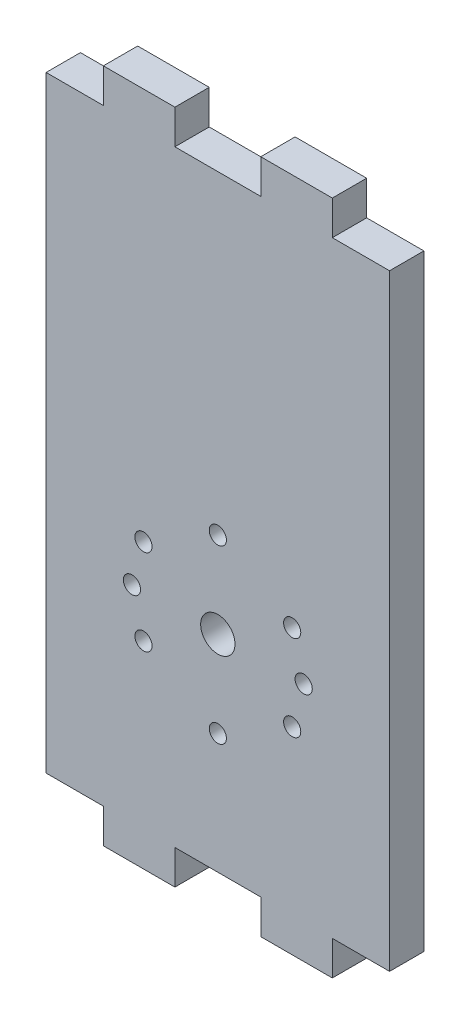
ISO-10303-21;
HEADER;
FILE_DESCRIPTION(('STEP AP214'),'2;1');
FILE_NAME('part.step','',(''),(''),'','','');
FILE_SCHEMA(('AUTOMOTIVE_DESIGN { 1 0 10303 214 1 1 1 1 }'));
ENDSEC;
DATA;
#1=APPLICATION_CONTEXT('core data for automotive mechanical design processes');
#2=APPLICATION_PROTOCOL_DEFINITION('international standard','automotive_design',2000,#1);
#3=PRODUCT_CONTEXT('',#1,'mechanical');
#4=PRODUCT('Part','Part','',(#3));
#5=PRODUCT_RELATED_PRODUCT_CATEGORY('part','',(#4));
#6=PRODUCT_DEFINITION_FORMATION('','',#4);
#7=PRODUCT_DEFINITION_CONTEXT('part definition',#1,'design');
#8=PRODUCT_DEFINITION('design','',#6,#7);
#9=PRODUCT_DEFINITION_SHAPE('','',#8);
#10=(LENGTH_UNIT() NAMED_UNIT(*) SI_UNIT(.MILLI.,.METRE.));
#11=(NAMED_UNIT(*) PLANE_ANGLE_UNIT() SI_UNIT($,.RADIAN.));
#12=(NAMED_UNIT(*) SI_UNIT($,.STERADIAN.) SOLID_ANGLE_UNIT());
#13=UNCERTAINTY_MEASURE_WITH_UNIT(LENGTH_MEASURE(1.E-05),#10,'distance_accuracy_value','');
#14=(GEOMETRIC_REPRESENTATION_CONTEXT(3) GLOBAL_UNCERTAINTY_ASSIGNED_CONTEXT((#13)) GLOBAL_UNIT_ASSIGNED_CONTEXT((#10,
#11,#12)) REPRESENTATION_CONTEXT('',''));
#15=CARTESIAN_POINT('',(0.,0.,0.));
#16=DIRECTION('',(0.,0.,1.));
#17=DIRECTION('',(1.,0.,0.));
#18=AXIS2_PLACEMENT_3D('',#15,#16,#17);
#19=CARTESIAN_POINT('',(0.,0.,3.));
#20=DIRECTION('',(0.,0.,1.));
#21=DIRECTION('',(1.,0.,0.));
#22=AXIS2_PLACEMENT_3D('',#19,#20,#21);
#23=PLANE('',#22);
#24=CARTESIAN_POINT('',(-7.5,-8.5,3.));
#25=DIRECTION('',(0.,0.,1.));
#26=DIRECTION('',(1.,0.,0.));
#27=AXIS2_PLACEMENT_3D('',#24,#25,#26);
#28=CIRCLE('',#27,0.750000000000066);
#29=CARTESIAN_POINT('',(-6.74999999999993,-8.5,3.));
#30=VERTEX_POINT('',#29);
#31=EDGE_CURVE('E415',#30,#30,#28,.T.);
#32=ORIENTED_EDGE('',*,*,#31,.F.);
#33=EDGE_LOOP('',(#32));
#34=FACE_BOUND('',#33,.T.);
#35=CARTESIAN_POINT('',(-6.49519052838329,-12.25,3.));
#36=DIRECTION('',(0.,0.,1.));
#37=DIRECTION('',(1.,0.,0.));
#38=AXIS2_PLACEMENT_3D('',#35,#36,#37);
#39=CIRCLE('',#38,0.75000000000007);
#40=CARTESIAN_POINT('',(-5.74519052838322,-12.25,3.));
#41=VERTEX_POINT('',#40);
#42=EDGE_CURVE('E427',#41,#41,#39,.T.);
#43=ORIENTED_EDGE('',*,*,#42,.F.);
#44=EDGE_LOOP('',(#43));
#45=FACE_BOUND('',#44,.T.);
#46=CARTESIAN_POINT('',(6.49519052838327,-12.25,3.));
#47=DIRECTION('',(0.,0.,1.));
#48=DIRECTION('',(1.,0.,0.));
#49=AXIS2_PLACEMENT_3D('',#46,#47,#48);
#50=CIRCLE('',#49,0.750000000000045);
#51=CARTESIAN_POINT('',(7.24519052838331,-12.25,3.));
#52=VERTEX_POINT('',#51);
#53=EDGE_CURVE('E439',#52,#52,#50,.T.);
#54=ORIENTED_EDGE('',*,*,#53,.F.);
#55=EDGE_LOOP('',(#54));
#56=FACE_BOUND('',#55,.T.);
#57=CARTESIAN_POINT('',(0.,-8.5,3.));
#58=DIRECTION('',(0.,0.,1.));
#59=DIRECTION('',(1.,0.,0.));
#60=AXIS2_PLACEMENT_3D('',#57,#58,#59);
#61=CIRCLE('',#60,1.5);
#62=CARTESIAN_POINT('',(1.5,-8.5,3.));
#63=VERTEX_POINT('',#62);
#64=EDGE_CURVE('E451',#63,#63,#61,.T.);
#65=ORIENTED_EDGE('',*,*,#64,.F.);
#66=EDGE_LOOP('',(#65));
#67=FACE_BOUND('',#66,.T.);
#68=DIRECTION('',(0.,-1.,0.));
#69=VECTOR('',#68,1.);
#70=CARTESIAN_POINT('',(-15.,26.5,3.));
#71=LINE('',#70,#69);
#72=CARTESIAN_POINT('',(-15.,26.5,3.));
#73=VERTEX_POINT('',#72);
#74=CARTESIAN_POINT('',(-15.,-26.5,3.));
#75=VERTEX_POINT('',#74);
#76=EDGE_CURVE('E241',#73,#75,#71,.T.);
#77=ORIENTED_EDGE('',*,*,#76,.T.);
#78=DIRECTION('',(1.,0.,0.));
#79=VECTOR('',#78,1.);
#80=CARTESIAN_POINT('',(-15.,-26.5,3.));
#81=LINE('',#80,#79);
#82=CARTESIAN_POINT('',(-10.,-26.5,3.));
#83=VERTEX_POINT('',#82);
#84=EDGE_CURVE('E129',#75,#83,#81,.T.);
#85=ORIENTED_EDGE('',*,*,#84,.T.);
#86=DIRECTION('',(0.,-1.,0.));
#87=VECTOR('',#86,1.);
#88=CARTESIAN_POINT('',(-10.,-26.5,3.));
#89=LINE('',#88,#87);
#90=CARTESIAN_POINT('',(-10.,-29.5,3.));
#91=VERTEX_POINT('',#90);
#92=EDGE_CURVE('E292',#83,#91,#89,.T.);
#93=ORIENTED_EDGE('',*,*,#92,.T.);
#94=DIRECTION('',(1.,0.,0.));
#95=VECTOR('',#94,1.);
#96=CARTESIAN_POINT('',(-10.,-29.5,3.));
#97=LINE('',#96,#95);
#98=CARTESIAN_POINT('',(-3.75,-29.5,3.));
#99=VERTEX_POINT('',#98);
#100=EDGE_CURVE('E311',#91,#99,#97,.T.);
#101=ORIENTED_EDGE('',*,*,#100,.T.);
#102=DIRECTION('',(0.,1.,0.));
#103=VECTOR('',#102,1.);
#104=CARTESIAN_POINT('',(-3.75,-29.5,3.));
#105=LINE('',#104,#103);
#106=CARTESIAN_POINT('',(-3.74999999999999,-26.5,3.));
#107=VERTEX_POINT('',#106);
#108=EDGE_CURVE('E308',#99,#107,#105,.T.);
#109=ORIENTED_EDGE('',*,*,#108,.T.);
#110=DIRECTION('',(1.,0.,0.));
#111=VECTOR('',#110,1.);
#112=CARTESIAN_POINT('',(-3.74999999999999,-26.5,3.));
#113=LINE('',#112,#111);
#114=CARTESIAN_POINT('',(3.75,-26.5,3.));
#115=VERTEX_POINT('',#114);
#116=EDGE_CURVE('E310',#107,#115,#113,.T.);
#117=ORIENTED_EDGE('',*,*,#116,.T.);
#118=DIRECTION('',(0.,-1.,0.));
#119=VECTOR('',#118,1.);
#120=CARTESIAN_POINT('',(3.75,-26.5,3.));
#121=LINE('',#120,#119);
#122=CARTESIAN_POINT('',(3.75000000000001,-29.5,3.));
#123=VERTEX_POINT('',#122);
#124=EDGE_CURVE('E313',#115,#123,#121,.T.);
#125=ORIENTED_EDGE('',*,*,#124,.T.);
#126=DIRECTION('',(1.,0.,0.));
#127=VECTOR('',#126,1.);
#128=CARTESIAN_POINT('',(3.75000000000001,-29.5,3.));
#129=LINE('',#128,#127);
#130=CARTESIAN_POINT('',(10.,-29.5,3.));
#131=VERTEX_POINT('',#130);
#132=EDGE_CURVE('E319',#123,#131,#129,.T.);
#133=ORIENTED_EDGE('',*,*,#132,.T.);
#134=DIRECTION('',(0.,1.,0.));
#135=VECTOR('',#134,1.);
#136=CARTESIAN_POINT('',(10.,-29.5,3.));
#137=LINE('',#136,#135);
#138=CARTESIAN_POINT('',(10.,-26.5,3.));
#139=VERTEX_POINT('',#138);
#140=EDGE_CURVE('E321',#131,#139,#137,.T.);
#141=ORIENTED_EDGE('',*,*,#140,.T.);
#142=DIRECTION('',(1.,0.,0.));
#143=VECTOR('',#142,1.);
#144=CARTESIAN_POINT('',(10.,-26.5,3.));
#145=LINE('',#144,#143);
#146=CARTESIAN_POINT('',(15.,-26.5,3.));
#147=VERTEX_POINT('',#146);
#148=EDGE_CURVE('E323',#139,#147,#145,.T.);
#149=ORIENTED_EDGE('',*,*,#148,.T.);
#150=DIRECTION('',(0.,1.,0.));
#151=VECTOR('',#150,1.);
#152=CARTESIAN_POINT('',(15.,26.5,3.));
#153=LINE('',#152,#151);
#154=CARTESIAN_POINT('',(15.,26.5,3.));
#155=VERTEX_POINT('',#154);
#156=EDGE_CURVE('E325',#147,#155,#153,.T.);
#157=ORIENTED_EDGE('',*,*,#156,.T.);
#158=DIRECTION('',(-1.,0.,0.));
#159=VECTOR('',#158,1.);
#160=CARTESIAN_POINT('',(10.,26.5,3.));
#161=LINE('',#160,#159);
#162=CARTESIAN_POINT('',(10.,26.5,3.));
#163=VERTEX_POINT('',#162);
#164=EDGE_CURVE('E327',#155,#163,#161,.T.);
#165=ORIENTED_EDGE('',*,*,#164,.T.);
#166=DIRECTION('',(0.,1.,0.));
#167=VECTOR('',#166,1.);
#168=CARTESIAN_POINT('',(10.,29.5,3.));
#169=LINE('',#168,#167);
#170=CARTESIAN_POINT('',(10.,29.5,3.));
#171=VERTEX_POINT('',#170);
#172=EDGE_CURVE('E329',#163,#171,#169,.T.);
#173=ORIENTED_EDGE('',*,*,#172,.T.);
#174=DIRECTION('',(-1.,0.,0.));
#175=VECTOR('',#174,1.);
#176=CARTESIAN_POINT('',(3.75,29.5,3.));
#177=LINE('',#176,#175);
#178=CARTESIAN_POINT('',(3.75,29.5,3.));
#179=VERTEX_POINT('',#178);
#180=EDGE_CURVE('E331',#171,#179,#177,.T.);
#181=ORIENTED_EDGE('',*,*,#180,.T.);
#182=DIRECTION('',(0.,-1.,0.));
#183=VECTOR('',#182,1.);
#184=CARTESIAN_POINT('',(3.75,26.5,3.));
#185=LINE('',#184,#183);
#186=CARTESIAN_POINT('',(3.75,26.5,3.));
#187=VERTEX_POINT('',#186);
#188=EDGE_CURVE('E333',#179,#187,#185,.T.);
#189=ORIENTED_EDGE('',*,*,#188,.T.);
#190=DIRECTION('',(-1.,0.,0.));
#191=VECTOR('',#190,1.);
#192=CARTESIAN_POINT('',(-3.75,26.5,3.));
#193=LINE('',#192,#191);
#194=CARTESIAN_POINT('',(-3.75,26.5,3.));
#195=VERTEX_POINT('',#194);
#196=EDGE_CURVE('E335',#187,#195,#193,.T.);
#197=ORIENTED_EDGE('',*,*,#196,.T.);
#198=DIRECTION('',(0.,1.,0.));
#199=VECTOR('',#198,1.);
#200=CARTESIAN_POINT('',(-3.75,29.5,3.));
#201=LINE('',#200,#199);
#202=CARTESIAN_POINT('',(-3.75,29.5,3.));
#203=VERTEX_POINT('',#202);
#204=EDGE_CURVE('E184',#195,#203,#201,.T.);
#205=ORIENTED_EDGE('',*,*,#204,.T.);
#206=DIRECTION('',(-1.,0.,0.));
#207=VECTOR('',#206,1.);
#208=CARTESIAN_POINT('',(-10.,29.5,3.));
#209=LINE('',#208,#207);
#210=CARTESIAN_POINT('',(-10.,29.5,3.));
#211=VERTEX_POINT('',#210);
#212=EDGE_CURVE('E178',#203,#211,#209,.T.);
#213=ORIENTED_EDGE('',*,*,#212,.T.);
#214=DIRECTION('',(0.,-1.,0.));
#215=VECTOR('',#214,1.);
#216=CARTESIAN_POINT('',(-10.,26.5,3.));
#217=LINE('',#216,#215);
#218=CARTESIAN_POINT('',(-10.,26.5,3.));
#219=VERTEX_POINT('',#218);
#220=EDGE_CURVE('E182',#211,#219,#217,.T.);
#221=ORIENTED_EDGE('',*,*,#220,.T.);
#222=DIRECTION('',(-1.,0.,0.));
#223=VECTOR('',#222,1.);
#224=CARTESIAN_POINT('',(-15.,26.5,3.));
#225=LINE('',#224,#223);
#226=EDGE_CURVE('E50',#219,#73,#225,.T.);
#227=ORIENTED_EDGE('',*,*,#226,.T.);
#228=EDGE_LOOP('',(#77,#85,#93,#101,#109,#117,#125,#133,#141,#149,#157,#165,#173,#181,#189,#197,
#205,#213,#221,#227));
#229=FACE_BOUND('',#228,.T.);
#230=CARTESIAN_POINT('',(0.,-1.,3.));
#231=DIRECTION('',(0.,0.,1.));
#232=DIRECTION('',(1.,0.,0.));
#233=AXIS2_PLACEMENT_3D('',#230,#231,#232);
#234=CIRCLE('',#233,0.750000000000065);
#235=CARTESIAN_POINT('',(0.750000000000065,-1.,3.));
#236=VERTEX_POINT('',#235);
#237=EDGE_CURVE('E206',#236,#236,#234,.T.);
#238=ORIENTED_EDGE('',*,*,#237,.F.);
#239=EDGE_LOOP('',(#238));
#240=FACE_BOUND('',#239,.T.);
#241=CARTESIAN_POINT('',(6.49519052838329,-4.75000000000001,3.));
#242=DIRECTION('',(0.,0.,1.));
#243=DIRECTION('',(1.,0.,0.));
#244=AXIS2_PLACEMENT_3D('',#241,#242,#243);
#245=CIRCLE('',#244,0.750000000000064);
#246=CARTESIAN_POINT('',(7.24519052838335,-4.75000000000001,3.));
#247=VERTEX_POINT('',#246);
#248=EDGE_CURVE('E445',#247,#247,#245,.T.);
#249=ORIENTED_EDGE('',*,*,#248,.F.);
#250=EDGE_LOOP('',(#249));
#251=FACE_BOUND('',#250,.T.);
#252=CARTESIAN_POINT('',(0.,-16.,3.));
#253=DIRECTION('',(0.,0.,1.));
#254=DIRECTION('',(1.,0.,0.));
#255=AXIS2_PLACEMENT_3D('',#252,#253,#254);
#256=CIRCLE('',#255,0.750000000000065);
#257=CARTESIAN_POINT('',(0.750000000000086,-16.,3.));
#258=VERTEX_POINT('',#257);
#259=EDGE_CURVE('E433',#258,#258,#256,.T.);
#260=ORIENTED_EDGE('',*,*,#259,.F.);
#261=EDGE_LOOP('',(#260));
#262=FACE_BOUND('',#261,.T.);
#263=CARTESIAN_POINT('',(-6.49519052838331,-4.75000000000004,3.));
#264=DIRECTION('',(0.,0.,1.));
#265=DIRECTION('',(1.,0.,0.));
#266=AXIS2_PLACEMENT_3D('',#263,#264,#265);
#267=CIRCLE('',#266,0.750000000000043);
#268=CARTESIAN_POINT('',(-5.74519052838327,-4.75000000000004,3.));
#269=VERTEX_POINT('',#268);
#270=EDGE_CURVE('E421',#269,#269,#267,.T.);
#271=ORIENTED_EDGE('',*,*,#270,.F.);
#272=EDGE_LOOP('',(#271));
#273=FACE_BOUND('',#272,.T.);
#274=CARTESIAN_POINT('',(7.5,-8.5,3.));
#275=DIRECTION('',(0.,0.,1.));
#276=DIRECTION('',(1.,0.,0.));
#277=AXIS2_PLACEMENT_3D('',#274,#275,#276);
#278=CIRCLE('',#277,0.750000000000067);
#279=CARTESIAN_POINT('',(8.25000000000006,-8.5,3.));
#280=VERTEX_POINT('',#279);
#281=EDGE_CURVE('E406',#280,#280,#278,.T.);
#282=ORIENTED_EDGE('',*,*,#281,.F.);
#283=EDGE_LOOP('',(#282));
#284=FACE_BOUND('',#283,.T.);
#285=ADVANCED_FACE('F33',(#34,#45,#56,#67,#229,#240,#251,#262,#273,#284),#23,.T.);
#286=CARTESIAN_POINT('',(0.,0.,0.));
#287=DIRECTION('',(0.,0.,1.));
#288=DIRECTION('',(1.,0.,0.));
#289=AXIS2_PLACEMENT_3D('',#286,#287,#288);
#290=PLANE('',#289);
#291=DIRECTION('',(0.,-1.,0.));
#292=VECTOR('',#291,1.);
#293=CARTESIAN_POINT('',(-15.,26.5,0.));
#294=LINE('',#293,#292);
#295=CARTESIAN_POINT('',(-15.,26.5,0.));
#296=VERTEX_POINT('',#295);
#297=CARTESIAN_POINT('',(-15.,-26.5,0.));
#298=VERTEX_POINT('',#297);
#299=EDGE_CURVE('E202',#296,#298,#294,.T.);
#300=ORIENTED_EDGE('',*,*,#299,.F.);
#301=DIRECTION('',(-1.,0.,0.));
#302=VECTOR('',#301,1.);
#303=CARTESIAN_POINT('',(-15.,26.5,0.));
#304=LINE('',#303,#302);
#305=CARTESIAN_POINT('',(-10.,26.5,0.));
#306=VERTEX_POINT('',#305);
#307=EDGE_CURVE('E121',#306,#296,#304,.T.);
#308=ORIENTED_EDGE('',*,*,#307,.F.);
#309=DIRECTION('',(0.,-1.,0.));
#310=VECTOR('',#309,1.);
#311=CARTESIAN_POINT('',(-10.,26.5,0.));
#312=LINE('',#311,#310);
#313=CARTESIAN_POINT('',(-10.,29.5,0.));
#314=VERTEX_POINT('',#313);
#315=EDGE_CURVE('E115',#314,#306,#312,.T.);
#316=ORIENTED_EDGE('',*,*,#315,.F.);
#317=DIRECTION('',(-1.,0.,0.));
#318=VECTOR('',#317,1.);
#319=CARTESIAN_POINT('',(-10.,29.5,0.));
#320=LINE('',#319,#318);
#321=CARTESIAN_POINT('',(-3.75,29.5,0.));
#322=VERTEX_POINT('',#321);
#323=EDGE_CURVE('E192',#322,#314,#320,.T.);
#324=ORIENTED_EDGE('',*,*,#323,.F.);
#325=DIRECTION('',(0.,1.,0.));
#326=VECTOR('',#325,1.);
#327=CARTESIAN_POINT('',(-3.75,29.5,0.));
#328=LINE('',#327,#326);
#329=CARTESIAN_POINT('',(-3.75,26.5,0.));
#330=VERTEX_POINT('',#329);
#331=EDGE_CURVE('E236',#330,#322,#328,.T.);
#332=ORIENTED_EDGE('',*,*,#331,.F.);
#333=DIRECTION('',(-1.,0.,0.));
#334=VECTOR('',#333,1.);
#335=CARTESIAN_POINT('',(-3.75,26.5,0.));
#336=LINE('',#335,#334);
#337=CARTESIAN_POINT('',(3.75,26.5,0.));
#338=VERTEX_POINT('',#337);
#339=EDGE_CURVE('E234',#338,#330,#336,.T.);
#340=ORIENTED_EDGE('',*,*,#339,.F.);
#341=DIRECTION('',(0.,-1.,0.));
#342=VECTOR('',#341,1.);
#343=CARTESIAN_POINT('',(3.75,26.5,0.));
#344=LINE('',#343,#342);
#345=CARTESIAN_POINT('',(3.75,29.5,0.));
#346=VERTEX_POINT('',#345);
#347=EDGE_CURVE('E232',#346,#338,#344,.T.);
#348=ORIENTED_EDGE('',*,*,#347,.F.);
#349=DIRECTION('',(-1.,0.,0.));
#350=VECTOR('',#349,1.);
#351=CARTESIAN_POINT('',(3.75,29.5,0.));
#352=LINE('',#351,#350);
#353=CARTESIAN_POINT('',(10.,29.5,0.));
#354=VERTEX_POINT('',#353);
#355=EDGE_CURVE('E230',#354,#346,#352,.T.);
#356=ORIENTED_EDGE('',*,*,#355,.F.);
#357=DIRECTION('',(0.,1.,0.));
#358=VECTOR('',#357,1.);
#359=CARTESIAN_POINT('',(10.,29.5,0.));
#360=LINE('',#359,#358);
#361=CARTESIAN_POINT('',(10.,26.5,0.));
#362=VERTEX_POINT('',#361);
#363=EDGE_CURVE('E228',#362,#354,#360,.T.);
#364=ORIENTED_EDGE('',*,*,#363,.F.);
#365=DIRECTION('',(-1.,0.,0.));
#366=VECTOR('',#365,1.);
#367=CARTESIAN_POINT('',(10.,26.5,0.));
#368=LINE('',#367,#366);
#369=CARTESIAN_POINT('',(15.,26.5,0.));
#370=VERTEX_POINT('',#369);
#371=EDGE_CURVE('E226',#370,#362,#368,.T.);
#372=ORIENTED_EDGE('',*,*,#371,.F.);
#373=DIRECTION('',(0.,1.,0.));
#374=VECTOR('',#373,1.);
#375=CARTESIAN_POINT('',(15.,26.5,0.));
#376=LINE('',#375,#374);
#377=CARTESIAN_POINT('',(15.,-26.5,0.));
#378=VERTEX_POINT('',#377);
#379=EDGE_CURVE('E224',#378,#370,#376,.T.);
#380=ORIENTED_EDGE('',*,*,#379,.F.);
#381=DIRECTION('',(1.,0.,0.));
#382=VECTOR('',#381,1.);
#383=CARTESIAN_POINT('',(10.,-26.5,0.));
#384=LINE('',#383,#382);
#385=CARTESIAN_POINT('',(10.,-26.5,0.));
#386=VERTEX_POINT('',#385);
#387=EDGE_CURVE('E222',#386,#378,#384,.T.);
#388=ORIENTED_EDGE('',*,*,#387,.F.);
#389=DIRECTION('',(0.,1.,0.));
#390=VECTOR('',#389,1.);
#391=CARTESIAN_POINT('',(10.,-29.5,0.));
#392=LINE('',#391,#390);
#393=CARTESIAN_POINT('',(10.,-29.5,0.));
#394=VERTEX_POINT('',#393);
#395=EDGE_CURVE('E220',#394,#386,#392,.T.);
#396=ORIENTED_EDGE('',*,*,#395,.F.);
#397=DIRECTION('',(1.,0.,0.));
#398=VECTOR('',#397,1.);
#399=CARTESIAN_POINT('',(3.75000000000001,-29.5,0.));
#400=LINE('',#399,#398);
#401=CARTESIAN_POINT('',(3.75000000000001,-29.5,0.));
#402=VERTEX_POINT('',#401);
#403=EDGE_CURVE('E218',#402,#394,#400,.T.);
#404=ORIENTED_EDGE('',*,*,#403,.F.);
#405=DIRECTION('',(0.,-1.,0.));
#406=VECTOR('',#405,1.);
#407=CARTESIAN_POINT('',(3.75,-26.5,0.));
#408=LINE('',#407,#406);
#409=CARTESIAN_POINT('',(3.75,-26.5,0.));
#410=VERTEX_POINT('',#409);
#411=EDGE_CURVE('E216',#410,#402,#408,.T.);
#412=ORIENTED_EDGE('',*,*,#411,.F.);
#413=DIRECTION('',(1.,0.,0.));
#414=VECTOR('',#413,1.);
#415=CARTESIAN_POINT('',(-3.74999999999999,-26.5,0.));
#416=LINE('',#415,#414);
#417=CARTESIAN_POINT('',(-3.74999999999999,-26.5,0.));
#418=VERTEX_POINT('',#417);
#419=EDGE_CURVE('E214',#418,#410,#416,.T.);
#420=ORIENTED_EDGE('',*,*,#419,.F.);
#421=DIRECTION('',(0.,1.,0.));
#422=VECTOR('',#421,1.);
#423=CARTESIAN_POINT('',(-3.75,-29.5,0.));
#424=LINE('',#423,#422);
#425=CARTESIAN_POINT('',(-3.75,-29.5,0.));
#426=VERTEX_POINT('',#425);
#427=EDGE_CURVE('E212',#426,#418,#424,.T.);
#428=ORIENTED_EDGE('',*,*,#427,.F.);
#429=DIRECTION('',(1.,0.,0.));
#430=VECTOR('',#429,1.);
#431=CARTESIAN_POINT('',(-10.,-29.5,0.));
#432=LINE('',#431,#430);
#433=CARTESIAN_POINT('',(-10.,-29.5,0.));
#434=VERTEX_POINT('',#433);
#435=EDGE_CURVE('E210',#434,#426,#432,.T.);
#436=ORIENTED_EDGE('',*,*,#435,.F.);
#437=DIRECTION('',(0.,-1.,0.));
#438=VECTOR('',#437,1.);
#439=CARTESIAN_POINT('',(-10.,-26.5,0.));
#440=LINE('',#439,#438);
#441=CARTESIAN_POINT('',(-10.,-26.5,0.));
#442=VERTEX_POINT('',#441);
#443=EDGE_CURVE('E208',#442,#434,#440,.T.);
#444=ORIENTED_EDGE('',*,*,#443,.F.);
#445=DIRECTION('',(1.,0.,0.));
#446=VECTOR('',#445,1.);
#447=CARTESIAN_POINT('',(-15.,-26.5,0.));
#448=LINE('',#447,#446);
#449=EDGE_CURVE('E205',#298,#442,#448,.T.);
#450=ORIENTED_EDGE('',*,*,#449,.F.);
#451=EDGE_LOOP('',(#300,#308,#316,#324,#332,#340,#348,#356,#364,#372,#380,#388,#396,#404,#412,
#420,#428,#436,#444,#450));
#452=FACE_BOUND('',#451,.T.);
#453=CARTESIAN_POINT('',(0.,-1.,0.));
#454=DIRECTION('',(0.,0.,1.));
#455=DIRECTION('',(1.,0.,0.));
#456=AXIS2_PLACEMENT_3D('',#453,#454,#455);
#457=CIRCLE('',#456,0.750000000000065);
#458=CARTESIAN_POINT('',(0.750000000000065,-1.,0.));
#459=VERTEX_POINT('',#458);
#460=EDGE_CURVE('E454',#459,#459,#457,.T.);
#461=ORIENTED_EDGE('',*,*,#460,.T.);
#462=EDGE_LOOP('',(#461));
#463=FACE_BOUND('',#462,.T.);
#464=CARTESIAN_POINT('',(0.,-8.5,0.));
#465=DIRECTION('',(0.,0.,1.));
#466=DIRECTION('',(1.,0.,0.));
#467=AXIS2_PLACEMENT_3D('',#464,#465,#466);
#468=CIRCLE('',#467,1.5);
#469=CARTESIAN_POINT('',(1.5,-8.5,0.));
#470=VERTEX_POINT('',#469);
#471=EDGE_CURVE('E448',#470,#470,#468,.T.);
#472=ORIENTED_EDGE('',*,*,#471,.T.);
#473=EDGE_LOOP('',(#472));
#474=FACE_BOUND('',#473,.T.);
#475=CARTESIAN_POINT('',(6.49519052838329,-4.75000000000001,0.));
#476=DIRECTION('',(0.,0.,1.));
#477=DIRECTION('',(1.,0.,0.));
#478=AXIS2_PLACEMENT_3D('',#475,#476,#477);
#479=CIRCLE('',#478,0.750000000000064);
#480=CARTESIAN_POINT('',(7.24519052838335,-4.75000000000001,0.));
#481=VERTEX_POINT('',#480);
#482=EDGE_CURVE('E442',#481,#481,#479,.T.);
#483=ORIENTED_EDGE('',*,*,#482,.T.);
#484=EDGE_LOOP('',(#483));
#485=FACE_BOUND('',#484,.T.);
#486=CARTESIAN_POINT('',(6.49519052838327,-12.25,0.));
#487=DIRECTION('',(0.,0.,1.));
#488=DIRECTION('',(1.,0.,0.));
#489=AXIS2_PLACEMENT_3D('',#486,#487,#488);
#490=CIRCLE('',#489,0.750000000000045);
#491=CARTESIAN_POINT('',(7.24519052838331,-12.25,0.));
#492=VERTEX_POINT('',#491);
#493=EDGE_CURVE('E436',#492,#492,#490,.T.);
#494=ORIENTED_EDGE('',*,*,#493,.T.);
#495=EDGE_LOOP('',(#494));
#496=FACE_BOUND('',#495,.T.);
#497=CARTESIAN_POINT('',(0.,-16.,0.));
#498=DIRECTION('',(0.,0.,1.));
#499=DIRECTION('',(1.,0.,0.));
#500=AXIS2_PLACEMENT_3D('',#497,#498,#499);
#501=CIRCLE('',#500,0.750000000000065);
#502=CARTESIAN_POINT('',(0.750000000000086,-16.,0.));
#503=VERTEX_POINT('',#502);
#504=EDGE_CURVE('E430',#503,#503,#501,.T.);
#505=ORIENTED_EDGE('',*,*,#504,.T.);
#506=EDGE_LOOP('',(#505));
#507=FACE_BOUND('',#506,.T.);
#508=CARTESIAN_POINT('',(-6.49519052838329,-12.25,0.));
#509=DIRECTION('',(0.,0.,1.));
#510=DIRECTION('',(1.,0.,0.));
#511=AXIS2_PLACEMENT_3D('',#508,#509,#510);
#512=CIRCLE('',#511,0.75000000000007);
#513=CARTESIAN_POINT('',(-5.74519052838322,-12.25,0.));
#514=VERTEX_POINT('',#513);
#515=EDGE_CURVE('E424',#514,#514,#512,.T.);
#516=ORIENTED_EDGE('',*,*,#515,.T.);
#517=EDGE_LOOP('',(#516));
#518=FACE_BOUND('',#517,.T.);
#519=CARTESIAN_POINT('',(-6.49519052838331,-4.75000000000004,0.));
#520=DIRECTION('',(0.,0.,1.));
#521=DIRECTION('',(1.,0.,0.));
#522=AXIS2_PLACEMENT_3D('',#519,#520,#521);
#523=CIRCLE('',#522,0.750000000000043);
#524=CARTESIAN_POINT('',(-5.74519052838327,-4.75000000000004,0.));
#525=VERTEX_POINT('',#524);
#526=EDGE_CURVE('E418',#525,#525,#523,.T.);
#527=ORIENTED_EDGE('',*,*,#526,.T.);
#528=EDGE_LOOP('',(#527));
#529=FACE_BOUND('',#528,.T.);
#530=CARTESIAN_POINT('',(-7.5,-8.5,0.));
#531=DIRECTION('',(0.,0.,1.));
#532=DIRECTION('',(1.,0.,0.));
#533=AXIS2_PLACEMENT_3D('',#530,#531,#532);
#534=CIRCLE('',#533,0.750000000000066);
#535=CARTESIAN_POINT('',(-6.74999999999993,-8.5,0.));
#536=VERTEX_POINT('',#535);
#537=EDGE_CURVE('E412',#536,#536,#534,.T.);
#538=ORIENTED_EDGE('',*,*,#537,.T.);
#539=EDGE_LOOP('',(#538));
#540=FACE_BOUND('',#539,.T.);
#541=CARTESIAN_POINT('',(7.5,-8.5,0.));
#542=DIRECTION('',(0.,0.,1.));
#543=DIRECTION('',(1.,0.,0.));
#544=AXIS2_PLACEMENT_3D('',#541,#542,#543);
#545=CIRCLE('',#544,0.750000000000067);
#546=CARTESIAN_POINT('',(8.25000000000006,-8.5,0.));
#547=VERTEX_POINT('',#546);
#548=EDGE_CURVE('E409',#547,#547,#545,.T.);
#549=ORIENTED_EDGE('',*,*,#548,.T.);
#550=EDGE_LOOP('',(#549));
#551=FACE_BOUND('',#550,.T.);
#552=ADVANCED_FACE('F296',(#452,#463,#474,#485,#496,#507,#518,#529,#540,#551),#290,.F.);
#553=CARTESIAN_POINT('',(-15.,26.5,3.));
#554=DIRECTION('',(1.,0.,0.));
#555=DIRECTION('',(0.,0.,-1.));
#556=AXIS2_PLACEMENT_3D('',#553,#554,#555);
#557=PLANE('',#556);
#558=ORIENTED_EDGE('',*,*,#299,.T.);
#559=DIRECTION('',(0.,0.,-1.));
#560=VECTOR('',#559,1.);
#561=CARTESIAN_POINT('',(-15.,-26.5,3.));
#562=LINE('',#561,#560);
#563=EDGE_CURVE('E11',#75,#298,#562,.T.);
#564=ORIENTED_EDGE('',*,*,#563,.F.);
#565=ORIENTED_EDGE('',*,*,#76,.F.);
#566=DIRECTION('',(0.,0.,-1.));
#567=VECTOR('',#566,1.);
#568=CARTESIAN_POINT('',(-15.,26.5,3.));
#569=LINE('',#568,#567);
#570=EDGE_CURVE('E198',#73,#296,#569,.T.);
#571=ORIENTED_EDGE('',*,*,#570,.T.);
#572=EDGE_LOOP('',(#558,#564,#565,#571));
#573=FACE_BOUND('',#572,.T.);
#574=ADVANCED_FACE('F35',(#573),#557,.F.);
#575=CARTESIAN_POINT('',(-15.,-26.5,3.));
#576=DIRECTION('',(0.,1.,0.));
#577=DIRECTION('',(0.,0.,1.));
#578=AXIS2_PLACEMENT_3D('',#575,#576,#577);
#579=PLANE('',#578);
#580=ORIENTED_EDGE('',*,*,#449,.T.);
#581=DIRECTION('',(0.,0.,-1.));
#582=VECTOR('',#581,1.);
#583=CARTESIAN_POINT('',(-10.,-26.5,3.));
#584=LINE('',#583,#582);
#585=EDGE_CURVE('E42',#83,#442,#584,.T.);
#586=ORIENTED_EDGE('',*,*,#585,.F.);
#587=ORIENTED_EDGE('',*,*,#84,.F.);
#588=ORIENTED_EDGE('',*,*,#563,.T.);
#589=EDGE_LOOP('',(#580,#586,#587,#588));
#590=FACE_BOUND('',#589,.T.);
#591=ADVANCED_FACE('F689',(#590),#579,.F.);
#592=CARTESIAN_POINT('',(-10.,-26.5,3.));
#593=DIRECTION('',(1.,0.,0.));
#594=DIRECTION('',(0.,0.,-1.));
#595=AXIS2_PLACEMENT_3D('',#592,#593,#594);
#596=PLANE('',#595);
#597=ORIENTED_EDGE('',*,*,#443,.T.);
#598=DIRECTION('',(0.,0.,-1.));
#599=VECTOR('',#598,1.);
#600=CARTESIAN_POINT('',(-10.,-29.5,3.));
#601=LINE('',#600,#599);
#602=EDGE_CURVE('E284',#91,#434,#601,.T.);
#603=ORIENTED_EDGE('',*,*,#602,.F.);
#604=ORIENTED_EDGE('',*,*,#92,.F.);
#605=ORIENTED_EDGE('',*,*,#585,.T.);
#606=EDGE_LOOP('',(#597,#603,#604,#605));
#607=FACE_BOUND('',#606,.T.);
#608=ADVANCED_FACE('F290',(#607),#596,.F.);
#609=CARTESIAN_POINT('',(-10.,-29.5,3.));
#610=DIRECTION('',(0.,1.,0.));
#611=DIRECTION('',(-1.,0.,0.));
#612=AXIS2_PLACEMENT_3D('',#609,#610,#611);
#613=PLANE('',#612);
#614=ORIENTED_EDGE('',*,*,#435,.T.);
#615=DIRECTION('',(0.,0.,-1.));
#616=VECTOR('',#615,1.);
#617=CARTESIAN_POINT('',(-3.75,-29.5,3.));
#618=LINE('',#617,#616);
#619=EDGE_CURVE('E281',#99,#426,#618,.T.);
#620=ORIENTED_EDGE('',*,*,#619,.F.);
#621=ORIENTED_EDGE('',*,*,#100,.F.);
#622=ORIENTED_EDGE('',*,*,#602,.T.);
#623=EDGE_LOOP('',(#614,#620,#621,#622));
#624=FACE_BOUND('',#623,.T.);
#625=ADVANCED_FACE('F302',(#624),#613,.F.);
#626=CARTESIAN_POINT('',(-3.75,-29.5,3.));
#627=DIRECTION('',(-1.,0.,0.));
#628=DIRECTION('',(0.,-1.,0.));
#629=AXIS2_PLACEMENT_3D('',#626,#627,#628);
#630=PLANE('',#629);
#631=ORIENTED_EDGE('',*,*,#427,.T.);
#632=DIRECTION('',(0.,0.,-1.));
#633=VECTOR('',#632,1.);
#634=CARTESIAN_POINT('',(-3.74999999999999,-26.5,3.));
#635=LINE('',#634,#633);
#636=EDGE_CURVE('E278',#107,#418,#635,.T.);
#637=ORIENTED_EDGE('',*,*,#636,.F.);
#638=ORIENTED_EDGE('',*,*,#108,.F.);
#639=ORIENTED_EDGE('',*,*,#619,.T.);
#640=EDGE_LOOP('',(#631,#637,#638,#639));
#641=FACE_BOUND('',#640,.T.);
#642=ADVANCED_FACE('F306',(#641),#630,.F.);
#643=CARTESIAN_POINT('',(-3.74999999999999,-26.5,3.));
#644=DIRECTION('',(0.,1.,0.));
#645=DIRECTION('',(0.,0.,1.));
#646=AXIS2_PLACEMENT_3D('',#643,#644,#645);
#647=PLANE('',#646);
#648=ORIENTED_EDGE('',*,*,#419,.T.);
#649=DIRECTION('',(0.,0.,-1.));
#650=VECTOR('',#649,1.);
#651=CARTESIAN_POINT('',(3.75,-26.5,3.));
#652=LINE('',#651,#650);
#653=EDGE_CURVE('E275',#115,#410,#652,.T.);
#654=ORIENTED_EDGE('',*,*,#653,.F.);
#655=ORIENTED_EDGE('',*,*,#116,.F.);
#656=ORIENTED_EDGE('',*,*,#636,.T.);
#657=EDGE_LOOP('',(#648,#654,#655,#656));
#658=FACE_BOUND('',#657,.T.);
#659=ADVANCED_FACE('F654',(#658),#647,.F.);
#660=CARTESIAN_POINT('',(3.75,-26.5,3.));
#661=DIRECTION('',(1.,0.,0.));
#662=DIRECTION('',(0.,1.,0.));
#663=AXIS2_PLACEMENT_3D('',#660,#661,#662);
#664=PLANE('',#663);
#665=ORIENTED_EDGE('',*,*,#411,.T.);
#666=DIRECTION('',(0.,0.,-1.));
#667=VECTOR('',#666,1.);
#668=CARTESIAN_POINT('',(3.75000000000001,-29.5,3.));
#669=LINE('',#668,#667);
#670=EDGE_CURVE('E272',#123,#402,#669,.T.);
#671=ORIENTED_EDGE('',*,*,#670,.F.);
#672=ORIENTED_EDGE('',*,*,#124,.F.);
#673=ORIENTED_EDGE('',*,*,#653,.T.);
#674=EDGE_LOOP('',(#665,#671,#672,#673));
#675=FACE_BOUND('',#674,.T.);
#676=ADVANCED_FACE('F644',(#675),#664,.F.);
#677=CARTESIAN_POINT('',(3.75000000000001,-29.5,3.));
#678=DIRECTION('',(0.,1.,0.));
#679=DIRECTION('',(-1.,0.,0.));
#680=AXIS2_PLACEMENT_3D('',#677,#678,#679);
#681=PLANE('',#680);
#682=ORIENTED_EDGE('',*,*,#403,.T.);
#683=DIRECTION('',(0.,0.,-1.));
#684=VECTOR('',#683,1.);
#685=CARTESIAN_POINT('',(10.,-29.5,3.));
#686=LINE('',#685,#684);
#687=EDGE_CURVE('E269',#131,#394,#686,.T.);
#688=ORIENTED_EDGE('',*,*,#687,.F.);
#689=ORIENTED_EDGE('',*,*,#132,.F.);
#690=ORIENTED_EDGE('',*,*,#670,.T.);
#691=EDGE_LOOP('',(#682,#688,#689,#690));
#692=FACE_BOUND('',#691,.T.);
#693=ADVANCED_FACE('F634',(#692),#681,.F.);
#694=CARTESIAN_POINT('',(10.,-29.5,3.));
#695=DIRECTION('',(-1.,0.,0.));
#696=DIRECTION('',(0.,0.,1.));
#697=AXIS2_PLACEMENT_3D('',#694,#695,#696);
#698=PLANE('',#697);
#699=ORIENTED_EDGE('',*,*,#395,.T.);
#700=DIRECTION('',(0.,0.,-1.));
#701=VECTOR('',#700,1.);
#702=CARTESIAN_POINT('',(10.,-26.5,3.));
#703=LINE('',#702,#701);
#704=EDGE_CURVE('E266',#139,#386,#703,.T.);
#705=ORIENTED_EDGE('',*,*,#704,.F.);
#706=ORIENTED_EDGE('',*,*,#140,.F.);
#707=ORIENTED_EDGE('',*,*,#687,.T.);
#708=EDGE_LOOP('',(#699,#705,#706,#707));
#709=FACE_BOUND('',#708,.T.);
#710=ADVANCED_FACE('F624',(#709),#698,.F.);
#711=CARTESIAN_POINT('',(10.,-26.5,3.));
#712=DIRECTION('',(0.,1.,0.));
#713=DIRECTION('',(0.,0.,1.));
#714=AXIS2_PLACEMENT_3D('',#711,#712,#713);
#715=PLANE('',#714);
#716=ORIENTED_EDGE('',*,*,#387,.T.);
#717=DIRECTION('',(0.,0.,-1.));
#718=VECTOR('',#717,1.);
#719=CARTESIAN_POINT('',(15.,-26.5,3.));
#720=LINE('',#719,#718);
#721=EDGE_CURVE('E263',#147,#378,#720,.T.);
#722=ORIENTED_EDGE('',*,*,#721,.F.);
#723=ORIENTED_EDGE('',*,*,#148,.F.);
#724=ORIENTED_EDGE('',*,*,#704,.T.);
#725=EDGE_LOOP('',(#716,#722,#723,#724));
#726=FACE_BOUND('',#725,.T.);
#727=ADVANCED_FACE('F614',(#726),#715,.F.);
#728=CARTESIAN_POINT('',(15.,26.5,3.));
#729=DIRECTION('',(-1.,0.,0.));
#730=DIRECTION('',(0.,0.,1.));
#731=AXIS2_PLACEMENT_3D('',#728,#729,#730);
#732=PLANE('',#731);
#733=ORIENTED_EDGE('',*,*,#379,.T.);
#734=DIRECTION('',(0.,0.,-1.));
#735=VECTOR('',#734,1.);
#736=CARTESIAN_POINT('',(15.,26.5,3.));
#737=LINE('',#736,#735);
#738=EDGE_CURVE('E260',#155,#370,#737,.T.);
#739=ORIENTED_EDGE('',*,*,#738,.F.);
#740=ORIENTED_EDGE('',*,*,#156,.F.);
#741=ORIENTED_EDGE('',*,*,#721,.T.);
#742=EDGE_LOOP('',(#733,#739,#740,#741));
#743=FACE_BOUND('',#742,.T.);
#744=ADVANCED_FACE('F604',(#743),#732,.F.);
#745=CARTESIAN_POINT('',(10.,26.5,3.));
#746=DIRECTION('',(0.,-1.,0.));
#747=DIRECTION('',(0.,0.,-1.));
#748=AXIS2_PLACEMENT_3D('',#745,#746,#747);
#749=PLANE('',#748);
#750=ORIENTED_EDGE('',*,*,#371,.T.);
#751=DIRECTION('',(0.,0.,-1.));
#752=VECTOR('',#751,1.);
#753=CARTESIAN_POINT('',(10.,26.5,3.));
#754=LINE('',#753,#752);
#755=EDGE_CURVE('E257',#163,#362,#754,.T.);
#756=ORIENTED_EDGE('',*,*,#755,.F.);
#757=ORIENTED_EDGE('',*,*,#164,.F.);
#758=ORIENTED_EDGE('',*,*,#738,.T.);
#759=EDGE_LOOP('',(#750,#756,#757,#758));
#760=FACE_BOUND('',#759,.T.);
#761=ADVANCED_FACE('F594',(#760),#749,.F.);
#762=CARTESIAN_POINT('',(10.,29.5,3.));
#763=DIRECTION('',(-1.,0.,0.));
#764=DIRECTION('',(0.,0.,1.));
#765=AXIS2_PLACEMENT_3D('',#762,#763,#764);
#766=PLANE('',#765);
#767=ORIENTED_EDGE('',*,*,#363,.T.);
#768=DIRECTION('',(0.,0.,-1.));
#769=VECTOR('',#768,1.);
#770=CARTESIAN_POINT('',(10.,29.5,3.));
#771=LINE('',#770,#769);
#772=EDGE_CURVE('E254',#171,#354,#771,.T.);
#773=ORIENTED_EDGE('',*,*,#772,.F.);
#774=ORIENTED_EDGE('',*,*,#172,.F.);
#775=ORIENTED_EDGE('',*,*,#755,.T.);
#776=EDGE_LOOP('',(#767,#773,#774,#775));
#777=FACE_BOUND('',#776,.T.);
#778=ADVANCED_FACE('F584',(#777),#766,.F.);
#779=CARTESIAN_POINT('',(3.75,29.5,3.));
#780=DIRECTION('',(0.,-1.,0.));
#781=DIRECTION('',(1.,0.,0.));
#782=AXIS2_PLACEMENT_3D('',#779,#780,#781);
#783=PLANE('',#782);
#784=ORIENTED_EDGE('',*,*,#355,.T.);
#785=DIRECTION('',(0.,0.,-1.));
#786=VECTOR('',#785,1.);
#787=CARTESIAN_POINT('',(3.75,29.5,3.));
#788=LINE('',#787,#786);
#789=EDGE_CURVE('E251',#179,#346,#788,.T.);
#790=ORIENTED_EDGE('',*,*,#789,.F.);
#791=ORIENTED_EDGE('',*,*,#180,.F.);
#792=ORIENTED_EDGE('',*,*,#772,.T.);
#793=EDGE_LOOP('',(#784,#790,#791,#792));
#794=FACE_BOUND('',#793,.T.);
#795=ADVANCED_FACE('F574',(#794),#783,.F.);
#796=CARTESIAN_POINT('',(3.75,26.5,3.));
#797=DIRECTION('',(1.,0.,0.));
#798=DIRECTION('',(0.,1.,0.));
#799=AXIS2_PLACEMENT_3D('',#796,#797,#798);
#800=PLANE('',#799);
#801=ORIENTED_EDGE('',*,*,#347,.T.);
#802=DIRECTION('',(0.,0.,-1.));
#803=VECTOR('',#802,1.);
#804=CARTESIAN_POINT('',(3.75,26.5,3.));
#805=LINE('',#804,#803);
#806=EDGE_CURVE('E248',#187,#338,#805,.T.);
#807=ORIENTED_EDGE('',*,*,#806,.F.);
#808=ORIENTED_EDGE('',*,*,#188,.F.);
#809=ORIENTED_EDGE('',*,*,#789,.T.);
#810=EDGE_LOOP('',(#801,#807,#808,#809));
#811=FACE_BOUND('',#810,.T.);
#812=ADVANCED_FACE('F565',(#811),#800,.F.);
#813=CARTESIAN_POINT('',(-3.75,26.5,3.));
#814=DIRECTION('',(0.,-1.,0.));
#815=DIRECTION('',(0.,0.,-1.));
#816=AXIS2_PLACEMENT_3D('',#813,#814,#815);
#817=PLANE('',#816);
#818=ORIENTED_EDGE('',*,*,#339,.T.);
#819=DIRECTION('',(0.,0.,-1.));
#820=VECTOR('',#819,1.);
#821=CARTESIAN_POINT('',(-3.75,26.5,3.));
#822=LINE('',#821,#820);
#823=EDGE_CURVE('E245',#195,#330,#822,.T.);
#824=ORIENTED_EDGE('',*,*,#823,.F.);
#825=ORIENTED_EDGE('',*,*,#196,.F.);
#826=ORIENTED_EDGE('',*,*,#806,.T.);
#827=EDGE_LOOP('',(#818,#824,#825,#826));
#828=FACE_BOUND('',#827,.T.);
#829=ADVANCED_FACE('F341',(#828),#817,.F.);
#830=CARTESIAN_POINT('',(-3.75,29.5,3.));
#831=DIRECTION('',(-1.,0.,0.));
#832=DIRECTION('',(0.,0.,1.));
#833=AXIS2_PLACEMENT_3D('',#830,#831,#832);
#834=PLANE('',#833);
#835=ORIENTED_EDGE('',*,*,#331,.T.);
#836=DIRECTION('',(0.,0.,-1.));
#837=VECTOR('',#836,1.);
#838=CARTESIAN_POINT('',(-3.75,29.5,3.));
#839=LINE('',#838,#837);
#840=EDGE_CURVE('E193',#203,#322,#839,.T.);
#841=ORIENTED_EDGE('',*,*,#840,.F.);
#842=ORIENTED_EDGE('',*,*,#204,.F.);
#843=ORIENTED_EDGE('',*,*,#823,.T.);
#844=EDGE_LOOP('',(#835,#841,#842,#843));
#845=FACE_BOUND('',#844,.T.);
#846=ADVANCED_FACE('F345',(#845),#834,.F.);
#847=CARTESIAN_POINT('',(-10.,29.5,3.));
#848=DIRECTION('',(0.,-1.,0.));
#849=DIRECTION('',(1.,0.,0.));
#850=AXIS2_PLACEMENT_3D('',#847,#848,#849);
#851=PLANE('',#850);
#852=ORIENTED_EDGE('',*,*,#323,.T.);
#853=DIRECTION('',(0.,0.,-1.));
#854=VECTOR('',#853,1.);
#855=CARTESIAN_POINT('',(-10.,29.5,3.));
#856=LINE('',#855,#854);
#857=EDGE_CURVE('E189',#211,#314,#856,.T.);
#858=ORIENTED_EDGE('',*,*,#857,.F.);
#859=ORIENTED_EDGE('',*,*,#212,.F.);
#860=ORIENTED_EDGE('',*,*,#840,.T.);
#861=EDGE_LOOP('',(#852,#858,#859,#860));
#862=FACE_BOUND('',#861,.T.);
#863=ADVANCED_FACE('F190',(#862),#851,.F.);
#864=CARTESIAN_POINT('',(-10.,26.5,3.));
#865=DIRECTION('',(1.,0.,0.));
#866=DIRECTION('',(0.,0.,-1.));
#867=AXIS2_PLACEMENT_3D('',#864,#865,#866);
#868=PLANE('',#867);
#869=ORIENTED_EDGE('',*,*,#315,.T.);
#870=DIRECTION('',(0.,0.,-1.));
#871=VECTOR('',#870,1.);
#872=CARTESIAN_POINT('',(-10.,26.5,3.));
#873=LINE('',#872,#871);
#874=EDGE_CURVE('E194',#219,#306,#873,.T.);
#875=ORIENTED_EDGE('',*,*,#874,.F.);
#876=ORIENTED_EDGE('',*,*,#220,.F.);
#877=ORIENTED_EDGE('',*,*,#857,.T.);
#878=EDGE_LOOP('',(#869,#875,#876,#877));
#879=FACE_BOUND('',#878,.T.);
#880=ADVANCED_FACE('F196',(#879),#868,.F.);
#881=CARTESIAN_POINT('',(-15.,26.5,3.));
#882=DIRECTION('',(0.,-1.,0.));
#883=DIRECTION('',(0.,0.,-1.));
#884=AXIS2_PLACEMENT_3D('',#881,#882,#883);
#885=PLANE('',#884);
#886=ORIENTED_EDGE('',*,*,#307,.T.);
#887=ORIENTED_EDGE('',*,*,#570,.F.);
#888=ORIENTED_EDGE('',*,*,#226,.F.);
#889=ORIENTED_EDGE('',*,*,#874,.T.);
#890=EDGE_LOOP('',(#886,#887,#888,#889));
#891=FACE_BOUND('',#890,.T.);
#892=ADVANCED_FACE('F349',(#891),#885,.F.);
#893=CARTESIAN_POINT('',(0.,-1.,3.));
#894=DIRECTION('',(0.,0.,-1.));
#895=DIRECTION('',(-1.,0.,0.));
#896=AXIS2_PLACEMENT_3D('',#893,#894,#895);
#897=CYLINDRICAL_SURFACE('',#896,0.750000000000065);
#898=ORIENTED_EDGE('',*,*,#237,.T.);
#899=EDGE_LOOP('',(#898));
#900=FACE_BOUND('',#899,.T.);
#901=ORIENTED_EDGE('',*,*,#460,.F.);
#902=EDGE_LOOP('',(#901));
#903=FACE_BOUND('',#902,.T.);
#904=ADVANCED_FACE('F351',(#900,#903),#897,.F.);
#905=CARTESIAN_POINT('',(0.,-8.5,3.));
#906=DIRECTION('',(0.,0.,-1.));
#907=DIRECTION('',(-1.,0.,0.));
#908=AXIS2_PLACEMENT_3D('',#905,#906,#907);
#909=CYLINDRICAL_SURFACE('',#908,1.5);
#910=ORIENTED_EDGE('',*,*,#64,.T.);
#911=EDGE_LOOP('',(#910));
#912=FACE_BOUND('',#911,.T.);
#913=ORIENTED_EDGE('',*,*,#471,.F.);
#914=EDGE_LOOP('',(#913));
#915=FACE_BOUND('',#914,.T.);
#916=ADVANCED_FACE('F357',(#912,#915),#909,.F.);
#917=CARTESIAN_POINT('',(6.49519052838329,-4.75000000000001,3.));
#918=DIRECTION('',(0.,0.,-1.));
#919=DIRECTION('',(-1.,0.,0.));
#920=AXIS2_PLACEMENT_3D('',#917,#918,#919);
#921=CYLINDRICAL_SURFACE('',#920,0.750000000000064);
#922=ORIENTED_EDGE('',*,*,#248,.T.);
#923=EDGE_LOOP('',(#922));
#924=FACE_BOUND('',#923,.T.);
#925=ORIENTED_EDGE('',*,*,#482,.F.);
#926=EDGE_LOOP('',(#925));
#927=FACE_BOUND('',#926,.T.);
#928=ADVANCED_FACE('F373',(#924,#927),#921,.F.);
#929=CARTESIAN_POINT('',(6.49519052838327,-12.25,3.));
#930=DIRECTION('',(0.,0.,-1.));
#931=DIRECTION('',(-1.,0.,0.));
#932=AXIS2_PLACEMENT_3D('',#929,#930,#931);
#933=CYLINDRICAL_SURFACE('',#932,0.750000000000045);
#934=ORIENTED_EDGE('',*,*,#53,.T.);
#935=EDGE_LOOP('',(#934));
#936=FACE_BOUND('',#935,.T.);
#937=ORIENTED_EDGE('',*,*,#493,.F.);
#938=EDGE_LOOP('',(#937));
#939=FACE_BOUND('',#938,.T.);
#940=ADVANCED_FACE('F377',(#936,#939),#933,.F.);
#941=CARTESIAN_POINT('',(0.,-16.,3.));
#942=DIRECTION('',(0.,0.,-1.));
#943=DIRECTION('',(-1.,0.,0.));
#944=AXIS2_PLACEMENT_3D('',#941,#942,#943);
#945=CYLINDRICAL_SURFACE('',#944,0.750000000000065);
#946=ORIENTED_EDGE('',*,*,#259,.T.);
#947=EDGE_LOOP('',(#946));
#948=FACE_BOUND('',#947,.T.);
#949=ORIENTED_EDGE('',*,*,#504,.F.);
#950=EDGE_LOOP('',(#949));
#951=FACE_BOUND('',#950,.T.);
#952=ADVANCED_FACE('F381',(#948,#951),#945,.F.);
#953=CARTESIAN_POINT('',(-6.49519052838329,-12.25,3.));
#954=DIRECTION('',(0.,0.,-1.));
#955=DIRECTION('',(-1.,0.,0.));
#956=AXIS2_PLACEMENT_3D('',#953,#954,#955);
#957=CYLINDRICAL_SURFACE('',#956,0.75000000000007);
#958=ORIENTED_EDGE('',*,*,#42,.T.);
#959=EDGE_LOOP('',(#958));
#960=FACE_BOUND('',#959,.T.);
#961=ORIENTED_EDGE('',*,*,#515,.F.);
#962=EDGE_LOOP('',(#961));
#963=FACE_BOUND('',#962,.T.);
#964=ADVANCED_FACE('F385',(#960,#963),#957,.F.);
#965=CARTESIAN_POINT('',(-6.49519052838331,-4.75000000000004,3.));
#966=DIRECTION('',(0.,0.,-1.));
#967=DIRECTION('',(-1.,0.,0.));
#968=AXIS2_PLACEMENT_3D('',#965,#966,#967);
#969=CYLINDRICAL_SURFACE('',#968,0.750000000000043);
#970=ORIENTED_EDGE('',*,*,#270,.T.);
#971=EDGE_LOOP('',(#970));
#972=FACE_BOUND('',#971,.T.);
#973=ORIENTED_EDGE('',*,*,#526,.F.);
#974=EDGE_LOOP('',(#973));
#975=FACE_BOUND('',#974,.T.);
#976=ADVANCED_FACE('F389',(#972,#975),#969,.F.);
#977=CARTESIAN_POINT('',(-7.5,-8.5,3.));
#978=DIRECTION('',(0.,0.,-1.));
#979=DIRECTION('',(-1.,0.,0.));
#980=AXIS2_PLACEMENT_3D('',#977,#978,#979);
#981=CYLINDRICAL_SURFACE('',#980,0.750000000000066);
#982=ORIENTED_EDGE('',*,*,#31,.T.);
#983=EDGE_LOOP('',(#982));
#984=FACE_BOUND('',#983,.T.);
#985=ORIENTED_EDGE('',*,*,#537,.F.);
#986=EDGE_LOOP('',(#985));
#987=FACE_BOUND('',#986,.T.);
#988=ADVANCED_FACE('F393',(#984,#987),#981,.F.);
#989=CARTESIAN_POINT('',(7.5,-8.5,3.));
#990=DIRECTION('',(0.,0.,-1.));
#991=DIRECTION('',(-1.,0.,0.));
#992=AXIS2_PLACEMENT_3D('',#989,#990,#991);
#993=CYLINDRICAL_SURFACE('',#992,0.750000000000067);
#994=ORIENTED_EDGE('',*,*,#281,.T.);
#995=EDGE_LOOP('',(#994));
#996=FACE_BOUND('',#995,.T.);
#997=ORIENTED_EDGE('',*,*,#548,.F.);
#998=EDGE_LOOP('',(#997));
#999=FACE_BOUND('',#998,.T.);
#1000=ADVANCED_FACE('F397',(#996,#999),#993,.F.);
#1001=CLOSED_SHELL('',(#285,#552,#574,#591,#608,#625,#642,#659,#676,#693,#710,#727,#744,#761,
#778,#795,#812,#829,#846,#863,#880,#892,#904,#916,#928,#940,#952,#964,#976,#988,#1000));
#1002=MANIFOLD_SOLID_BREP('B2',#1001);
#1003=ADVANCED_BREP_SHAPE_REPRESENTATION('',(#18,#1002),#14);
#1004=SHAPE_DEFINITION_REPRESENTATION(#9,#1003);
ENDSEC;
END-ISO-10303-21;
